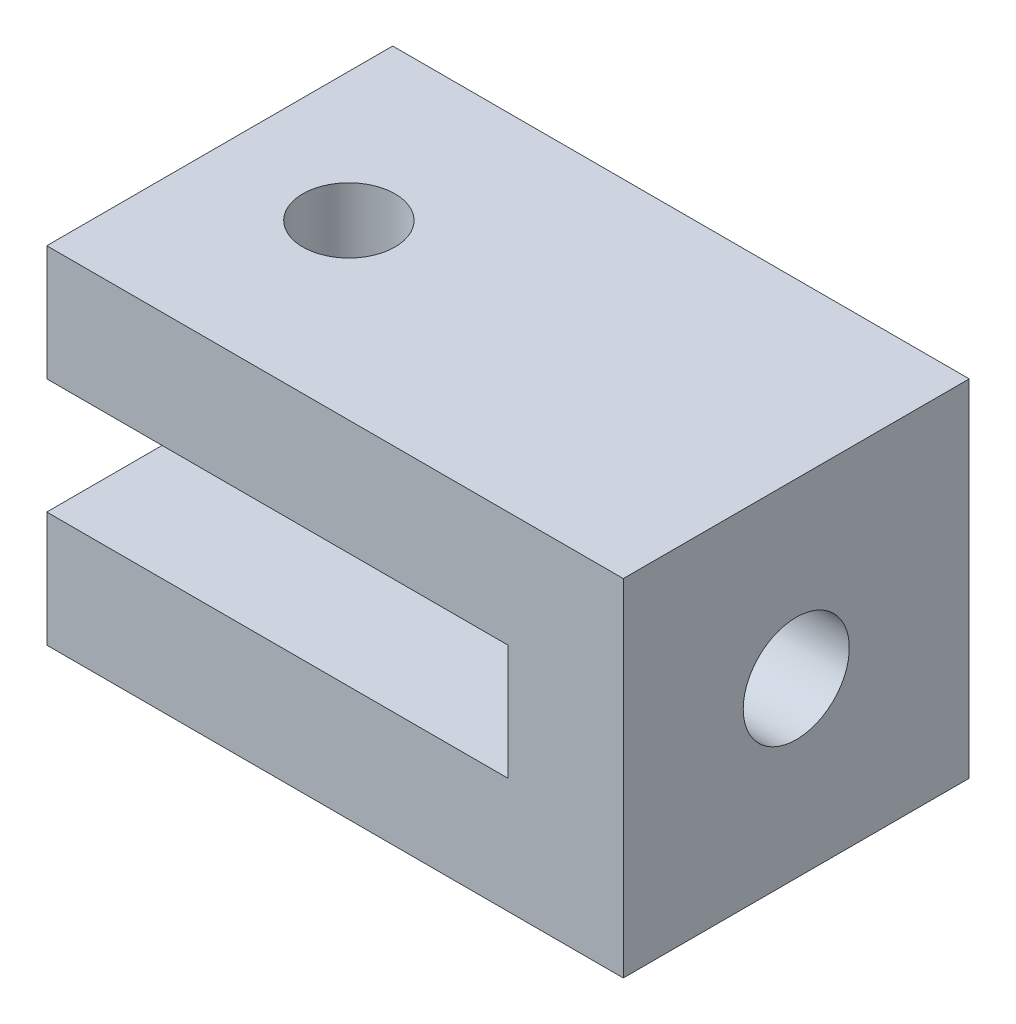
ISO-10303-21;
HEADER;
FILE_DESCRIPTION(('STEP AP214'),'2;1');
FILE_NAME('part.step','',(''),(''),'','','');
FILE_SCHEMA(('AUTOMOTIVE_DESIGN { 1 0 10303 214 1 1 1 1 }'));
ENDSEC;
DATA;
#1=APPLICATION_CONTEXT('core data for automotive mechanical design processes');
#2=APPLICATION_PROTOCOL_DEFINITION('international standard','automotive_design',2000,#1);
#3=PRODUCT_CONTEXT('',#1,'mechanical');
#4=PRODUCT('Part','Part','',(#3));
#5=PRODUCT_RELATED_PRODUCT_CATEGORY('part','',(#4));
#6=PRODUCT_DEFINITION_FORMATION('','',#4);
#7=PRODUCT_DEFINITION_CONTEXT('part definition',#1,'design');
#8=PRODUCT_DEFINITION('design','',#6,#7);
#9=PRODUCT_DEFINITION_SHAPE('','',#8);
#10=(LENGTH_UNIT() NAMED_UNIT(*) SI_UNIT(.MILLI.,.METRE.));
#11=(NAMED_UNIT(*) PLANE_ANGLE_UNIT() SI_UNIT($,.RADIAN.));
#12=(NAMED_UNIT(*) SI_UNIT($,.STERADIAN.) SOLID_ANGLE_UNIT());
#13=UNCERTAINTY_MEASURE_WITH_UNIT(LENGTH_MEASURE(1.E-05),#10,'distance_accuracy_value','');
#14=(GEOMETRIC_REPRESENTATION_CONTEXT(3) GLOBAL_UNCERTAINTY_ASSIGNED_CONTEXT((#13)) GLOBAL_UNIT_ASSIGNED_CONTEXT((#10,
#11,#12)) REPRESENTATION_CONTEXT('',''));
#15=CARTESIAN_POINT('',(0.,0.,0.));
#16=DIRECTION('',(0.,0.,1.));
#17=DIRECTION('',(1.,0.,0.));
#18=AXIS2_PLACEMENT_3D('',#15,#16,#17);
#19=CARTESIAN_POINT('',(-7.93750000000001,9.525,-4.7625));
#20=DIRECTION('',(1.,0.,0.));
#21=DIRECTION('',(0.,0.,-1.));
#22=AXIS2_PLACEMENT_3D('',#19,#20,#21);
#23=PLANE('',#22);
#24=DIRECTION('',(0.,-1.,0.));
#25=VECTOR('',#24,1.);
#26=CARTESIAN_POINT('',(-7.9375,9.525,4.7625));
#27=LINE('',#26,#25);
#28=CARTESIAN_POINT('',(-7.9375,3.175,4.7625));
#29=VERTEX_POINT('',#28);
#30=CARTESIAN_POINT('',(-7.9375,0.,4.7625));
#31=VERTEX_POINT('',#30);
#32=EDGE_CURVE('E179',#29,#31,#27,.T.);
#33=ORIENTED_EDGE('',*,*,#32,.F.);
#34=DIRECTION('',(0.,0.,1.));
#35=VECTOR('',#34,1.);
#36=CARTESIAN_POINT('',(-7.93750000000001,3.175,-4.76249999999999));
#37=LINE('',#36,#35);
#38=CARTESIAN_POINT('',(-7.93750000000001,3.175,-4.76249999999999));
#39=VERTEX_POINT('',#38);
#40=EDGE_CURVE('E136',#39,#29,#37,.T.);
#41=ORIENTED_EDGE('',*,*,#40,.F.);
#42=DIRECTION('',(0.,-1.,0.));
#43=VECTOR('',#42,1.);
#44=CARTESIAN_POINT('',(-7.93750000000001,9.525,-4.7625));
#45=LINE('',#44,#43);
#46=CARTESIAN_POINT('',(-7.93750000000001,0.,-4.7625));
#47=VERTEX_POINT('',#46);
#48=EDGE_CURVE('E182',#39,#47,#45,.T.);
#49=ORIENTED_EDGE('',*,*,#48,.T.);
#50=DIRECTION('',(0.,0.,1.));
#51=VECTOR('',#50,1.);
#52=CARTESIAN_POINT('',(-7.93750000000001,0.,-4.7625));
#53=LINE('',#52,#51);
#54=EDGE_CURVE('E171',#47,#31,#53,.T.);
#55=ORIENTED_EDGE('',*,*,#54,.T.);
#56=EDGE_LOOP('',(#33,#41,#49,#55));
#57=FACE_BOUND('',#56,.T.);
#58=ADVANCED_FACE('F45',(#57),#23,.F.);
#59=CARTESIAN_POINT('',(7.93749999999999,9.525,-4.7625));
#60=DIRECTION('',(-1.,0.,0.));
#61=DIRECTION('',(0.,0.,1.));
#62=AXIS2_PLACEMENT_3D('',#59,#60,#61);
#63=PLANE('',#62);
#64=CARTESIAN_POINT('',(7.93749999999999,4.7625,0.));
#65=DIRECTION('',(-1.,0.,0.));
#66=DIRECTION('',(0.,0.,1.));
#67=AXIS2_PLACEMENT_3D('',#64,#65,#66);
#68=CIRCLE('',#67,1.4605);
#69=CARTESIAN_POINT('',(7.93749999999999,4.7625,1.4605));
#70=VERTEX_POINT('',#69);
#71=EDGE_CURVE('E225',#70,#70,#68,.T.);
#72=ORIENTED_EDGE('',*,*,#71,.T.);
#73=EDGE_LOOP('',(#72));
#74=FACE_BOUND('',#73,.T.);
#75=DIRECTION('',(0.,0.,-1.));
#76=VECTOR('',#75,1.);
#77=CARTESIAN_POINT('',(7.93749999999999,0.,-4.7625));
#78=LINE('',#77,#76);
#79=CARTESIAN_POINT('',(7.93749999999999,0.,4.7625));
#80=VERTEX_POINT('',#79);
#81=CARTESIAN_POINT('',(7.93749999999999,0.,-4.7625));
#82=VERTEX_POINT('',#81);
#83=EDGE_CURVE('E162',#80,#82,#78,.T.);
#84=ORIENTED_EDGE('',*,*,#83,.T.);
#85=DIRECTION('',(0.,-1.,0.));
#86=VECTOR('',#85,1.);
#87=CARTESIAN_POINT('',(7.93749999999999,9.525,-4.7625));
#88=LINE('',#87,#86);
#89=CARTESIAN_POINT('',(7.93749999999999,9.525,-4.7625));
#90=VERTEX_POINT('',#89);
#91=EDGE_CURVE('E11',#90,#82,#88,.T.);
#92=ORIENTED_EDGE('',*,*,#91,.F.);
#93=DIRECTION('',(0.,0.,-1.));
#94=VECTOR('',#93,1.);
#95=CARTESIAN_POINT('',(7.93749999999999,9.525,-4.7625));
#96=LINE('',#95,#94);
#97=CARTESIAN_POINT('',(7.93749999999999,9.525,4.7625));
#98=VERTEX_POINT('',#97);
#99=EDGE_CURVE('E151',#98,#90,#96,.T.);
#100=ORIENTED_EDGE('',*,*,#99,.F.);
#101=DIRECTION('',(0.,-1.,0.));
#102=VECTOR('',#101,1.);
#103=CARTESIAN_POINT('',(7.93749999999999,9.525,4.7625));
#104=LINE('',#103,#102);
#105=EDGE_CURVE('E161',#98,#80,#104,.T.);
#106=ORIENTED_EDGE('',*,*,#105,.T.);
#107=EDGE_LOOP('',(#84,#92,#100,#106));
#108=FACE_BOUND('',#107,.T.);
#109=ADVANCED_FACE('F47',(#74,#108),#63,.F.);
#110=CARTESIAN_POINT('',(-7.93750000000001,9.525,-4.7625));
#111=DIRECTION('',(0.,0.,1.));
#112=DIRECTION('',(1.,0.,0.));
#113=AXIS2_PLACEMENT_3D('',#110,#111,#112);
#114=PLANE('',#113);
#115=ORIENTED_EDGE('',*,*,#48,.F.);
#116=DIRECTION('',(-1.,0.,0.));
#117=VECTOR('',#116,1.);
#118=CARTESIAN_POINT('',(4.76249999999999,3.175,-4.7625));
#119=LINE('',#118,#117);
#120=CARTESIAN_POINT('',(4.76249999999999,3.175,-4.7625));
#121=VERTEX_POINT('',#120);
#122=EDGE_CURVE('E146',#121,#39,#119,.T.);
#123=ORIENTED_EDGE('',*,*,#122,.F.);
#124=DIRECTION('',(0.,-1.,0.));
#125=VECTOR('',#124,1.);
#126=CARTESIAN_POINT('',(4.76249999999999,6.35,-4.76249999999999));
#127=LINE('',#126,#125);
#128=CARTESIAN_POINT('',(4.76249999999999,6.35,-4.76249999999999));
#129=VERTEX_POINT('',#128);
#130=EDGE_CURVE('E129',#129,#121,#127,.T.);
#131=ORIENTED_EDGE('',*,*,#130,.F.);
#132=DIRECTION('',(-1.,0.,0.));
#133=VECTOR('',#132,1.);
#134=CARTESIAN_POINT('',(4.76249999999999,6.35,-4.76249999999999));
#135=LINE('',#134,#133);
#136=CARTESIAN_POINT('',(-7.93750000000001,6.35,-4.76249999999999));
#137=VERTEX_POINT('',#136);
#138=EDGE_CURVE('E126',#129,#137,#135,.T.);
#139=ORIENTED_EDGE('',*,*,#138,.T.);
#140=CARTESIAN_POINT('',(-7.93750000000001,9.525,-4.7625));
#141=VERTEX_POINT('',#140);
#142=EDGE_CURVE('E55',#141,#137,#45,.T.);
#143=ORIENTED_EDGE('',*,*,#142,.F.);
#144=DIRECTION('',(-1.,0.,0.));
#145=VECTOR('',#144,1.);
#146=CARTESIAN_POINT('',(-7.93750000000001,9.525,-4.7625));
#147=LINE('',#146,#145);
#148=EDGE_CURVE('E98',#90,#141,#147,.T.);
#149=ORIENTED_EDGE('',*,*,#148,.F.);
#150=ORIENTED_EDGE('',*,*,#91,.T.);
#151=DIRECTION('',(-1.,0.,0.));
#152=VECTOR('',#151,1.);
#153=CARTESIAN_POINT('',(-7.93750000000001,0.,-4.7625));
#154=LINE('',#153,#152);
#155=EDGE_CURVE('E166',#82,#47,#154,.T.);
#156=ORIENTED_EDGE('',*,*,#155,.T.);
#157=EDGE_LOOP('',(#115,#123,#131,#139,#143,#149,#150,#156));
#158=FACE_BOUND('',#157,.T.);
#159=ADVANCED_FACE('F194',(#158),#114,.F.);
#160=ORIENTED_EDGE('',*,*,#142,.T.);
#161=DIRECTION('',(0.,0.,-1.));
#162=VECTOR('',#161,1.);
#163=CARTESIAN_POINT('',(-7.93750000000001,6.35,-4.76249999999999));
#164=LINE('',#163,#162);
#165=CARTESIAN_POINT('',(-7.9375,6.35,4.7625));
#166=VERTEX_POINT('',#165);
#167=EDGE_CURVE('E203',#166,#137,#164,.T.);
#168=ORIENTED_EDGE('',*,*,#167,.F.);
#169=CARTESIAN_POINT('',(-7.9375,9.525,4.7625));
#170=VERTEX_POINT('',#169);
#171=EDGE_CURVE('E141',#170,#166,#27,.T.);
#172=ORIENTED_EDGE('',*,*,#171,.F.);
#173=DIRECTION('',(0.,0.,1.));
#174=VECTOR('',#173,1.);
#175=CARTESIAN_POINT('',(-7.93750000000001,9.525,-4.7625));
#176=LINE('',#175,#174);
#177=EDGE_CURVE('E156',#141,#170,#176,.T.);
#178=ORIENTED_EDGE('',*,*,#177,.F.);
#179=EDGE_LOOP('',(#160,#168,#172,#178));
#180=FACE_BOUND('',#179,.T.);
#181=ADVANCED_FACE('F202',(#180),#23,.F.);
#182=CARTESIAN_POINT('',(-7.9375,9.525,4.7625));
#183=DIRECTION('',(0.,0.,-1.));
#184=DIRECTION('',(-1.,0.,0.));
#185=AXIS2_PLACEMENT_3D('',#182,#183,#184);
#186=PLANE('',#185);
#187=DIRECTION('',(0.,1.,0.));
#188=VECTOR('',#187,1.);
#189=CARTESIAN_POINT('',(4.7625,6.35,4.76249999999999));
#190=LINE('',#189,#188);
#191=CARTESIAN_POINT('',(4.7625,3.175,4.7625));
#192=VERTEX_POINT('',#191);
#193=CARTESIAN_POINT('',(4.7625,6.35,4.76249999999999));
#194=VERTEX_POINT('',#193);
#195=EDGE_CURVE('E130',#192,#194,#190,.T.);
#196=ORIENTED_EDGE('',*,*,#195,.F.);
#197=DIRECTION('',(-1.,0.,0.));
#198=VECTOR('',#197,1.);
#199=CARTESIAN_POINT('',(4.7625,3.175,4.76249999999999));
#200=LINE('',#199,#198);
#201=EDGE_CURVE('E167',#192,#29,#200,.T.);
#202=ORIENTED_EDGE('',*,*,#201,.T.);
#203=ORIENTED_EDGE('',*,*,#32,.T.);
#204=DIRECTION('',(1.,0.,0.));
#205=VECTOR('',#204,1.);
#206=CARTESIAN_POINT('',(-7.9375,0.,4.7625));
#207=LINE('',#206,#205);
#208=EDGE_CURVE('E91',#31,#80,#207,.T.);
#209=ORIENTED_EDGE('',*,*,#208,.T.);
#210=ORIENTED_EDGE('',*,*,#105,.F.);
#211=DIRECTION('',(1.,0.,0.));
#212=VECTOR('',#211,1.);
#213=CARTESIAN_POINT('',(-7.9375,9.525,4.7625));
#214=LINE('',#213,#212);
#215=EDGE_CURVE('E71',#170,#98,#214,.T.);
#216=ORIENTED_EDGE('',*,*,#215,.F.);
#217=ORIENTED_EDGE('',*,*,#171,.T.);
#218=DIRECTION('',(-1.,0.,0.));
#219=VECTOR('',#218,1.);
#220=CARTESIAN_POINT('',(4.7625,6.35,4.76249999999999));
#221=LINE('',#220,#219);
#222=EDGE_CURVE('E123',#194,#166,#221,.T.);
#223=ORIENTED_EDGE('',*,*,#222,.F.);
#224=EDGE_LOOP('',(#196,#202,#203,#209,#210,#216,#217,#223));
#225=FACE_BOUND('',#224,.T.);
#226=ADVANCED_FACE('F139',(#225),#186,.F.);
#227=CARTESIAN_POINT('',(0.,9.525,0.));
#228=DIRECTION('',(0.,1.,0.));
#229=DIRECTION('',(0.,0.,1.));
#230=AXIS2_PLACEMENT_3D('',#227,#228,#229);
#231=PLANE('',#230);
#232=CARTESIAN_POINT('',(-4.38150000000001,9.525,0.));
#233=DIRECTION('',(0.,-1.,0.));
#234=DIRECTION('',(0.,0.,-1.));
#235=AXIS2_PLACEMENT_3D('',#232,#233,#234);
#236=CIRCLE('',#235,1.27);
#237=CARTESIAN_POINT('',(-4.38150000000001,9.525,-1.27));
#238=VERTEX_POINT('',#237);
#239=EDGE_CURVE('E224',#238,#238,#236,.T.);
#240=ORIENTED_EDGE('',*,*,#239,.T.);
#241=EDGE_LOOP('',(#240));
#242=FACE_BOUND('',#241,.T.);
#243=ORIENTED_EDGE('',*,*,#99,.T.);
#244=ORIENTED_EDGE('',*,*,#148,.T.);
#245=ORIENTED_EDGE('',*,*,#177,.T.);
#246=ORIENTED_EDGE('',*,*,#215,.T.);
#247=EDGE_LOOP('',(#243,#244,#245,#246));
#248=FACE_BOUND('',#247,.T.);
#249=ADVANCED_FACE('F201',(#242,#248),#231,.T.);
#250=CARTESIAN_POINT('',(0.,0.,0.));
#251=DIRECTION('',(0.,1.,0.));
#252=DIRECTION('',(0.,0.,1.));
#253=AXIS2_PLACEMENT_3D('',#250,#251,#252);
#254=PLANE('',#253);
#255=CARTESIAN_POINT('',(-4.38150000000001,0.,0.));
#256=DIRECTION('',(0.,-1.,0.));
#257=DIRECTION('',(0.,0.,-1.));
#258=AXIS2_PLACEMENT_3D('',#255,#256,#257);
#259=CIRCLE('',#258,1.27);
#260=CARTESIAN_POINT('',(-4.38150000000001,0.,-1.27));
#261=VERTEX_POINT('',#260);
#262=EDGE_CURVE('E220',#261,#261,#259,.T.);
#263=ORIENTED_EDGE('',*,*,#262,.F.);
#264=EDGE_LOOP('',(#263));
#265=FACE_BOUND('',#264,.T.);
#266=ORIENTED_EDGE('',*,*,#83,.F.);
#267=ORIENTED_EDGE('',*,*,#208,.F.);
#268=ORIENTED_EDGE('',*,*,#54,.F.);
#269=ORIENTED_EDGE('',*,*,#155,.F.);
#270=EDGE_LOOP('',(#266,#267,#268,#269));
#271=FACE_BOUND('',#270,.T.);
#272=ADVANCED_FACE('F198',(#265,#271),#254,.F.);
#273=CARTESIAN_POINT('',(4.76249999999999,3.175,-4.7625));
#274=DIRECTION('',(0.,-1.,0.));
#275=DIRECTION('',(0.,0.,-1.));
#276=AXIS2_PLACEMENT_3D('',#273,#274,#275);
#277=PLANE('',#276);
#278=CARTESIAN_POINT('',(-4.38150000000001,3.175,0.));
#279=DIRECTION('',(0.,-1.,0.));
#280=DIRECTION('',(0.,0.,-1.));
#281=AXIS2_PLACEMENT_3D('',#278,#279,#280);
#282=CIRCLE('',#281,1.27);
#283=CARTESIAN_POINT('',(-4.38150000000001,3.175,-1.27));
#284=VERTEX_POINT('',#283);
#285=EDGE_CURVE('E205',#284,#284,#282,.T.);
#286=ORIENTED_EDGE('',*,*,#285,.T.);
#287=EDGE_LOOP('',(#286));
#288=FACE_BOUND('',#287,.T.);
#289=ORIENTED_EDGE('',*,*,#40,.T.);
#290=ORIENTED_EDGE('',*,*,#201,.F.);
#291=DIRECTION('',(0.,0.,1.));
#292=VECTOR('',#291,1.);
#293=CARTESIAN_POINT('',(4.76249999999999,3.175,-4.7625));
#294=LINE('',#293,#292);
#295=EDGE_CURVE('E62',#121,#192,#294,.T.);
#296=ORIENTED_EDGE('',*,*,#295,.F.);
#297=ORIENTED_EDGE('',*,*,#122,.T.);
#298=EDGE_LOOP('',(#289,#290,#296,#297));
#299=FACE_BOUND('',#298,.T.);
#300=ADVANCED_FACE('F217',(#288,#299),#277,.F.);
#301=CARTESIAN_POINT('',(4.76249999999999,6.35,-4.76249999999999));
#302=DIRECTION('',(0.,1.,0.));
#303=DIRECTION('',(0.,0.,1.));
#304=AXIS2_PLACEMENT_3D('',#301,#302,#303);
#305=PLANE('',#304);
#306=CARTESIAN_POINT('',(-4.38150000000001,6.35,0.));
#307=DIRECTION('',(0.,1.,0.));
#308=DIRECTION('',(0.,0.,1.));
#309=AXIS2_PLACEMENT_3D('',#306,#307,#308);
#310=CIRCLE('',#309,1.27);
#311=CARTESIAN_POINT('',(-4.38150000000001,6.35,-1.27));
#312=VERTEX_POINT('',#311);
#313=EDGE_CURVE('E49',#312,#312,#310,.T.);
#314=ORIENTED_EDGE('',*,*,#313,.T.);
#315=EDGE_LOOP('',(#314));
#316=FACE_BOUND('',#315,.T.);
#317=ORIENTED_EDGE('',*,*,#167,.T.);
#318=ORIENTED_EDGE('',*,*,#138,.F.);
#319=DIRECTION('',(0.,0.,-1.));
#320=VECTOR('',#319,1.);
#321=CARTESIAN_POINT('',(4.76249999999999,6.35,-4.76249999999999));
#322=LINE('',#321,#320);
#323=EDGE_CURVE('E120',#194,#129,#322,.T.);
#324=ORIENTED_EDGE('',*,*,#323,.F.);
#325=ORIENTED_EDGE('',*,*,#222,.T.);
#326=EDGE_LOOP('',(#317,#318,#324,#325));
#327=FACE_BOUND('',#326,.T.);
#328=ADVANCED_FACE('F121',(#316,#327),#305,.F.);
#329=CARTESIAN_POINT('',(4.76249999999999,0.,0.));
#330=DIRECTION('',(-1.,0.,0.));
#331=DIRECTION('',(0.,0.,1.));
#332=AXIS2_PLACEMENT_3D('',#329,#330,#331);
#333=PLANE('',#332);
#334=CARTESIAN_POINT('',(4.76249999999999,4.7625,0.));
#335=DIRECTION('',(-1.,0.,0.));
#336=DIRECTION('',(0.,0.,1.));
#337=AXIS2_PLACEMENT_3D('',#334,#335,#336);
#338=CIRCLE('',#337,1.4605);
#339=CARTESIAN_POINT('',(4.76249999999999,4.7625,1.4605));
#340=VERTEX_POINT('',#339);
#341=EDGE_CURVE('E229',#340,#340,#338,.T.);
#342=ORIENTED_EDGE('',*,*,#341,.F.);
#343=EDGE_LOOP('',(#342));
#344=FACE_BOUND('',#343,.T.);
#345=ORIENTED_EDGE('',*,*,#195,.T.);
#346=ORIENTED_EDGE('',*,*,#323,.T.);
#347=ORIENTED_EDGE('',*,*,#130,.T.);
#348=ORIENTED_EDGE('',*,*,#295,.T.);
#349=EDGE_LOOP('',(#345,#346,#347,#348));
#350=FACE_BOUND('',#349,.T.);
#351=ADVANCED_FACE('F133',(#344,#350),#333,.T.);
#352=CARTESIAN_POINT('',(-4.38150000000001,9.525,0.));
#353=DIRECTION('',(0.,-1.,0.));
#354=DIRECTION('',(0.,0.,-1.));
#355=AXIS2_PLACEMENT_3D('',#352,#353,#354);
#356=CYLINDRICAL_SURFACE('',#355,1.27);
#357=CARTESIAN_POINT('',(-4.38150000000001,9.525,-1.27));
#358=CARTESIAN_POINT('',(-4.38150000000001,9.49192708333334,-1.27));
#359=CARTESIAN_POINT('',(-4.38150000000001,9.45885416666667,-1.27));
#360=CARTESIAN_POINT('',(-4.38150000000001,9.39270833333333,-1.27));
#361=CARTESIAN_POINT('',(-4.38150000000001,9.35963541666667,-1.27));
#362=CARTESIAN_POINT('',(-4.38150000000001,9.29348958333333,-1.27));
#363=CARTESIAN_POINT('',(-4.38150000000001,9.26041666666667,-1.27));
#364=CARTESIAN_POINT('',(-4.38150000000001,9.19427083333334,-1.27));
#365=CARTESIAN_POINT('',(-4.38150000000001,9.16119791666667,-1.27));
#366=CARTESIAN_POINT('',(-4.38150000000001,9.09505208333333,-1.27));
#367=CARTESIAN_POINT('',(-4.38150000000001,9.06197916666667,-1.27));
#368=CARTESIAN_POINT('',(-4.38150000000001,8.99583333333334,-1.27));
#369=CARTESIAN_POINT('',(-4.38150000000001,8.96276041666667,-1.27));
#370=CARTESIAN_POINT('',(-4.38150000000001,8.89661458333333,-1.27));
#371=CARTESIAN_POINT('',(-4.38150000000001,8.86354166666667,-1.27));
#372=CARTESIAN_POINT('',(-4.38150000000001,8.79739583333333,-1.27));
#373=CARTESIAN_POINT('',(-4.38150000000001,8.76432291666667,-1.27));
#374=CARTESIAN_POINT('',(-4.38150000000001,8.69817708333333,-1.27));
#375=CARTESIAN_POINT('',(-4.38150000000001,8.66510416666667,-1.27));
#376=CARTESIAN_POINT('',(-4.38150000000001,8.59895833333333,-1.27));
#377=CARTESIAN_POINT('',(-4.38150000000001,8.56588541666667,-1.27));
#378=CARTESIAN_POINT('',(-4.38150000000001,8.49973958333333,-1.27));
#379=CARTESIAN_POINT('',(-4.38150000000001,8.46666666666667,-1.27));
#380=CARTESIAN_POINT('',(-4.38150000000001,8.40052083333333,-1.27));
#381=CARTESIAN_POINT('',(-4.38150000000001,8.36744791666667,-1.27));
#382=CARTESIAN_POINT('',(-4.38150000000001,8.30130208333333,-1.27));
#383=CARTESIAN_POINT('',(-4.38150000000001,8.26822916666667,-1.27));
#384=CARTESIAN_POINT('',(-4.38150000000001,8.20208333333333,-1.27));
#385=CARTESIAN_POINT('',(-4.38150000000001,8.16901041666667,-1.27));
#386=CARTESIAN_POINT('',(-4.38150000000001,8.10286458333333,-1.27));
#387=CARTESIAN_POINT('',(-4.38150000000001,8.06979166666667,-1.27));
#388=CARTESIAN_POINT('',(-4.38150000000001,8.00364583333334,-1.27));
#389=CARTESIAN_POINT('',(-4.38150000000001,7.97057291666667,-1.27));
#390=CARTESIAN_POINT('',(-4.38150000000001,7.90442708333333,-1.27));
#391=CARTESIAN_POINT('',(-4.38150000000001,7.87135416666667,-1.27));
#392=CARTESIAN_POINT('',(-4.38150000000001,7.80520833333333,-1.27));
#393=CARTESIAN_POINT('',(-4.38150000000001,7.77213541666667,-1.27));
#394=CARTESIAN_POINT('',(-4.38150000000001,7.70598958333333,-1.27));
#395=CARTESIAN_POINT('',(-4.38150000000001,7.67291666666667,-1.27));
#396=CARTESIAN_POINT('',(-4.38150000000001,7.60677083333333,-1.27));
#397=CARTESIAN_POINT('',(-4.38150000000001,7.57369791666667,-1.27));
#398=CARTESIAN_POINT('',(-4.38150000000001,7.50755208333333,-1.27));
#399=CARTESIAN_POINT('',(-4.38150000000001,7.47447916666667,-1.27));
#400=CARTESIAN_POINT('',(-4.38150000000001,7.40833333333333,-1.27));
#401=CARTESIAN_POINT('',(-4.38150000000001,7.37526041666667,-1.27));
#402=CARTESIAN_POINT('',(-4.38150000000001,7.30911458333333,-1.27));
#403=CARTESIAN_POINT('',(-4.38150000000001,7.27604166666667,-1.27));
#404=CARTESIAN_POINT('',(-4.38150000000001,7.20989583333333,-1.27));
#405=CARTESIAN_POINT('',(-4.38150000000001,7.17682291666667,-1.27));
#406=CARTESIAN_POINT('',(-4.38150000000001,7.11067708333333,-1.27));
#407=CARTESIAN_POINT('',(-4.38150000000001,7.07760416666667,-1.27));
#408=CARTESIAN_POINT('',(-4.38150000000001,7.01145833333333,-1.27));
#409=CARTESIAN_POINT('',(-4.38150000000001,6.97838541666667,-1.27));
#410=CARTESIAN_POINT('',(-4.38150000000001,6.91223958333333,-1.27));
#411=CARTESIAN_POINT('',(-4.38150000000001,6.87916666666667,-1.27));
#412=CARTESIAN_POINT('',(-4.38150000000001,6.81302083333333,-1.27));
#413=CARTESIAN_POINT('',(-4.38150000000001,6.77994791666667,-1.27));
#414=CARTESIAN_POINT('',(-4.38150000000001,6.71380208333333,-1.27));
#415=CARTESIAN_POINT('',(-4.38150000000001,6.68072916666667,-1.27));
#416=CARTESIAN_POINT('',(-4.38150000000001,6.61458333333333,-1.27));
#417=CARTESIAN_POINT('',(-4.38150000000001,6.58151041666667,-1.27));
#418=CARTESIAN_POINT('',(-4.38150000000001,6.51536458333333,-1.27));
#419=CARTESIAN_POINT('',(-4.38150000000001,6.48229166666667,-1.27));
#420=CARTESIAN_POINT('',(-4.38150000000001,6.41614583333333,-1.27));
#421=CARTESIAN_POINT('',(-4.38150000000001,6.38307291666667,-1.27));
#422=CARTESIAN_POINT('',(-4.38150000000001,6.35,-1.27));
#423=B_SPLINE_CURVE_WITH_KNOTS('',3,(#357,#358,#359,#360,#361,#362,#363,#364,#365,#366,#367,
#368,#369,#370,#371,#372,#373,#374,#375,#376,#377,#378,#379,#380,#381,#382,#383,#384,#385,#386,
#387,#388,#389,#390,#391,#392,#393,#394,#395,#396,#397,#398,#399,#400,#401,#402,#403,#404,#405,
#406,#407,#408,#409,#410,#411,#412,#413,#414,#415,#416,#417,#418,#419,#420,#421,#422),
.UNSPECIFIED.,.F.,.F.,(4,2,2,2,2,2,2,2,2,2,2,2,2,2,2,2,2,2,2,2,2,2,2,2,2,2,2,2,2,2,2,2,4),(0.,
0.0992187500000012,0.198437500000001,0.29765625,0.396875000000001,0.496093750000001,0.5953125,
0.694531250000002,0.793750000000001,0.892968750000002,0.992187500000002,1.09140625,1.190625,
1.28984375,1.3890625,1.48828125,1.5875,1.68671875,1.7859375,1.88515625,1.984375,2.08359375,
2.1828125,2.28203125,2.38125,2.48046875,2.5796875,2.67890625,2.778125,2.87734375,2.9765625,
3.07578125,3.175),.UNSPECIFIED.);
#424=EDGE_CURVE('BSEAM246',#238,#312,#423,.T.);
#425=ORIENTED_EDGE('',*,*,#239,.F.);
#426=ORIENTED_EDGE('',*,*,#313,.F.);
#427=ORIENTED_EDGE('',*,*,#424,.T.);
#428=ORIENTED_EDGE('',*,*,#424,.F.);
#429=EDGE_LOOP('',(#425,#427,#426,#428));
#430=FACE_BOUND('',#429,.T.);
#431=ADVANCED_FACE('F246',(#430),#356,.F.);
#432=CARTESIAN_POINT('',(-4.38150000000001,0.,-1.27));
#433=CARTESIAN_POINT('',(-4.38150000000001,0.0330729166666665,-1.27));
#434=CARTESIAN_POINT('',(-4.38150000000001,0.066145833333333,-1.27));
#435=CARTESIAN_POINT('',(-4.38150000000001,0.132291666666667,-1.27));
#436=CARTESIAN_POINT('',(-4.38150000000001,0.165364583333334,-1.27));
#437=CARTESIAN_POINT('',(-4.38150000000001,0.231510416666667,-1.27));
#438=CARTESIAN_POINT('',(-4.38150000000001,0.264583333333334,-1.27));
#439=CARTESIAN_POINT('',(-4.38150000000001,0.330729166666667,-1.27));
#440=CARTESIAN_POINT('',(-4.38150000000001,0.363802083333333,-1.27));
#441=CARTESIAN_POINT('',(-4.38150000000001,0.429947916666667,-1.27));
#442=CARTESIAN_POINT('',(-4.38150000000001,0.463020833333334,-1.27));
#443=CARTESIAN_POINT('',(-4.38150000000001,0.529166666666667,-1.27));
#444=CARTESIAN_POINT('',(-4.38150000000001,0.562239583333334,-1.27));
#445=CARTESIAN_POINT('',(-4.38150000000001,0.628385416666667,-1.27));
#446=CARTESIAN_POINT('',(-4.38150000000001,0.661458333333333,-1.27));
#447=CARTESIAN_POINT('',(-4.38150000000001,0.727604166666666,-1.27));
#448=CARTESIAN_POINT('',(-4.38150000000001,0.760677083333333,-1.27));
#449=CARTESIAN_POINT('',(-4.38150000000001,0.826822916666666,-1.27));
#450=CARTESIAN_POINT('',(-4.38150000000001,0.859895833333334,-1.27));
#451=CARTESIAN_POINT('',(-4.38150000000001,0.926041666666667,-1.27));
#452=CARTESIAN_POINT('',(-4.38150000000001,0.959114583333334,-1.27));
#453=CARTESIAN_POINT('',(-4.38150000000001,1.02526041666667,-1.27));
#454=CARTESIAN_POINT('',(-4.38150000000001,1.05833333333333,-1.27));
#455=CARTESIAN_POINT('',(-4.38150000000001,1.12447916666667,-1.27));
#456=CARTESIAN_POINT('',(-4.38150000000001,1.15755208333333,-1.27));
#457=CARTESIAN_POINT('',(-4.38150000000001,1.22369791666667,-1.27));
#458=CARTESIAN_POINT('',(-4.38150000000001,1.25677083333333,-1.27));
#459=CARTESIAN_POINT('',(-4.38150000000001,1.32291666666667,-1.27));
#460=CARTESIAN_POINT('',(-4.38150000000001,1.35598958333333,-1.27));
#461=CARTESIAN_POINT('',(-4.38150000000001,1.42213541666667,-1.27));
#462=CARTESIAN_POINT('',(-4.38150000000001,1.45520833333333,-1.27));
#463=CARTESIAN_POINT('',(-4.38150000000001,1.52135416666667,-1.27));
#464=CARTESIAN_POINT('',(-4.38150000000001,1.55442708333333,-1.27));
#465=CARTESIAN_POINT('',(-4.38150000000001,1.62057291666667,-1.27));
#466=CARTESIAN_POINT('',(-4.38150000000001,1.65364583333333,-1.27));
#467=CARTESIAN_POINT('',(-4.38150000000001,1.71979166666667,-1.27));
#468=CARTESIAN_POINT('',(-4.38150000000001,1.75286458333333,-1.27));
#469=CARTESIAN_POINT('',(-4.38150000000001,1.81901041666667,-1.27));
#470=CARTESIAN_POINT('',(-4.38150000000001,1.85208333333333,-1.27));
#471=CARTESIAN_POINT('',(-4.38150000000001,1.91822916666667,-1.27));
#472=CARTESIAN_POINT('',(-4.38150000000001,1.95130208333333,-1.27));
#473=CARTESIAN_POINT('',(-4.38150000000001,2.01744791666667,-1.27));
#474=CARTESIAN_POINT('',(-4.38150000000001,2.05052083333333,-1.27));
#475=CARTESIAN_POINT('',(-4.38150000000001,2.11666666666667,-1.27));
#476=CARTESIAN_POINT('',(-4.38150000000001,2.14973958333333,-1.27));
#477=CARTESIAN_POINT('',(-4.38150000000001,2.21588541666667,-1.27));
#478=CARTESIAN_POINT('',(-4.38150000000001,2.24895833333333,-1.27));
#479=CARTESIAN_POINT('',(-4.38150000000001,2.31510416666667,-1.27));
#480=CARTESIAN_POINT('',(-4.38150000000001,2.34817708333333,-1.27));
#481=CARTESIAN_POINT('',(-4.38150000000001,2.41432291666667,-1.27));
#482=CARTESIAN_POINT('',(-4.38150000000001,2.44739583333333,-1.27));
#483=CARTESIAN_POINT('',(-4.38150000000001,2.51354166666667,-1.27));
#484=CARTESIAN_POINT('',(-4.38150000000001,2.54661458333333,-1.27));
#485=CARTESIAN_POINT('',(-4.38150000000001,2.61276041666667,-1.27));
#486=CARTESIAN_POINT('',(-4.38150000000001,2.64583333333333,-1.27));
#487=CARTESIAN_POINT('',(-4.38150000000001,2.71197916666667,-1.27));
#488=CARTESIAN_POINT('',(-4.38150000000001,2.74505208333333,-1.27));
#489=CARTESIAN_POINT('',(-4.38150000000001,2.81119791666667,-1.27));
#490=CARTESIAN_POINT('',(-4.38150000000001,2.84427083333333,-1.27));
#491=CARTESIAN_POINT('',(-4.38150000000001,2.91041666666667,-1.27));
#492=CARTESIAN_POINT('',(-4.38150000000001,2.94348958333333,-1.27));
#493=CARTESIAN_POINT('',(-4.38150000000001,3.00963541666667,-1.27));
#494=CARTESIAN_POINT('',(-4.38150000000001,3.04270833333333,-1.27));
#495=CARTESIAN_POINT('',(-4.38150000000001,3.10885416666667,-1.27));
#496=CARTESIAN_POINT('',(-4.38150000000001,3.14192708333333,-1.27));
#497=CARTESIAN_POINT('',(-4.38150000000001,3.175,-1.27));
#498=B_SPLINE_CURVE_WITH_KNOTS('',3,(#432,#433,#434,#435,#436,#437,#438,#439,#440,#441,#442,
#443,#444,#445,#446,#447,#448,#449,#450,#451,#452,#453,#454,#455,#456,#457,#458,#459,#460,#461,
#462,#463,#464,#465,#466,#467,#468,#469,#470,#471,#472,#473,#474,#475,#476,#477,#478,#479,#480,
#481,#482,#483,#484,#485,#486,#487,#488,#489,#490,#491,#492,#493,#494,#495,#496,#497),
.UNSPECIFIED.,.F.,.F.,(4,2,2,2,2,2,2,2,2,2,2,2,2,2,2,2,2,2,2,2,2,2,2,2,2,2,2,2,2,2,2,2,4),(0.,
0.0992187499999995,0.198437500000001,0.29765625,0.396875,0.496093750000001,0.5953125,0.69453125,
0.793749999999999,0.892968750000001,0.9921875,1.09140625,1.190625,1.28984375,1.3890625,
1.48828125,1.5875,1.68671875,1.7859375,1.88515625,1.984375,2.08359375,2.1828125,2.28203125,
2.38125,2.48046875,2.5796875,2.67890625,2.778125,2.87734375,2.9765625,3.07578125,3.175),.UNSPECIFIED.);
#499=EDGE_CURVE('BSEAM241',#261,#284,#498,.T.);
#500=ORIENTED_EDGE('',*,*,#262,.T.);
#501=ORIENTED_EDGE('',*,*,#285,.F.);
#502=ORIENTED_EDGE('',*,*,#499,.T.);
#503=ORIENTED_EDGE('',*,*,#499,.F.);
#504=EDGE_LOOP('',(#500,#502,#501,#503));
#505=FACE_BOUND('',#504,.T.);
#506=ADVANCED_FACE('F241',(#505),#356,.F.);
#507=CARTESIAN_POINT('',(7.93749999999999,4.7625,0.));
#508=DIRECTION('',(-1.,0.,0.));
#509=DIRECTION('',(0.,0.,1.));
#510=AXIS2_PLACEMENT_3D('',#507,#508,#509);
#511=CYLINDRICAL_SURFACE('',#510,1.4605);
#512=ORIENTED_EDGE('',*,*,#71,.F.);
#513=EDGE_LOOP('',(#512));
#514=FACE_BOUND('',#513,.T.);
#515=ORIENTED_EDGE('',*,*,#341,.T.);
#516=EDGE_LOOP('',(#515));
#517=FACE_BOUND('',#516,.T.);
#518=ADVANCED_FACE('F238',(#514,#517),#511,.F.);
#519=CLOSED_SHELL('',(#58,#109,#159,#181,#226,#249,#272,#300,#328,#351,#431,#506,#518));
#520=MANIFOLD_SOLID_BREP('B2',#519);
#521=ADVANCED_BREP_SHAPE_REPRESENTATION('',(#18,#520),#14);
#522=SHAPE_DEFINITION_REPRESENTATION(#9,#521);
ENDSEC;
END-ISO-10303-21;
